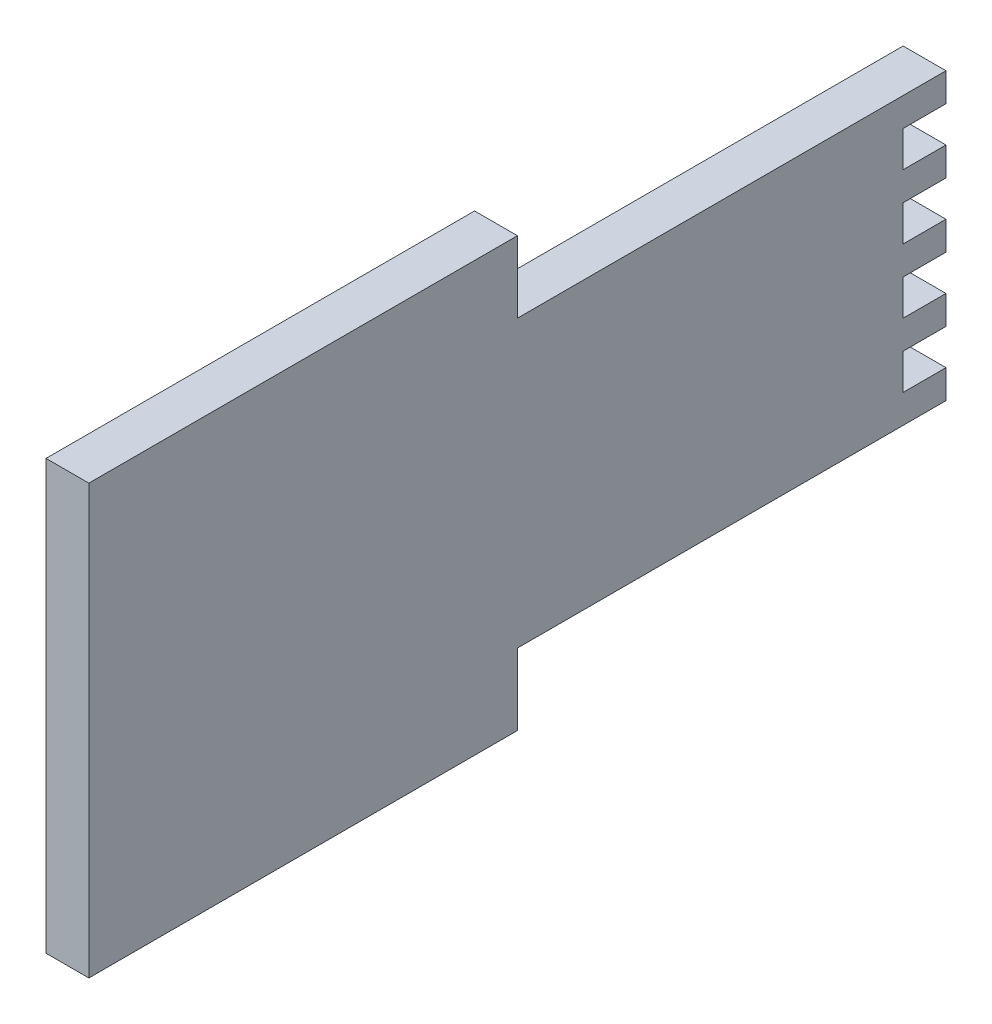
ISO-10303-21;
HEADER;
FILE_DESCRIPTION(('STEP AP214'),'2;1');
FILE_NAME('part.step','',(''),(''),'','','');
FILE_SCHEMA(('AUTOMOTIVE_DESIGN { 1 0 10303 214 1 1 1 1 }'));
ENDSEC;
DATA;
#1=APPLICATION_CONTEXT('core data for automotive mechanical design processes');
#2=APPLICATION_PROTOCOL_DEFINITION('international standard','automotive_design',2000,#1);
#3=PRODUCT_CONTEXT('',#1,'mechanical');
#4=PRODUCT('Part','Part','',(#3));
#5=PRODUCT_RELATED_PRODUCT_CATEGORY('part','',(#4));
#6=PRODUCT_DEFINITION_FORMATION('','',#4);
#7=PRODUCT_DEFINITION_CONTEXT('part definition',#1,'design');
#8=PRODUCT_DEFINITION('design','',#6,#7);
#9=PRODUCT_DEFINITION_SHAPE('','',#8);
#10=(LENGTH_UNIT() NAMED_UNIT(*) SI_UNIT(.MILLI.,.METRE.));
#11=(NAMED_UNIT(*) PLANE_ANGLE_UNIT() SI_UNIT($,.RADIAN.));
#12=(NAMED_UNIT(*) SI_UNIT($,.STERADIAN.) SOLID_ANGLE_UNIT());
#13=UNCERTAINTY_MEASURE_WITH_UNIT(LENGTH_MEASURE(1.E-05),#10,'distance_accuracy_value','');
#14=(GEOMETRIC_REPRESENTATION_CONTEXT(3) GLOBAL_UNCERTAINTY_ASSIGNED_CONTEXT((#13)) GLOBAL_UNIT_ASSIGNED_CONTEXT((#10,
#11,#12)) REPRESENTATION_CONTEXT('',''));
#15=CARTESIAN_POINT('',(0.,0.,0.));
#16=DIRECTION('',(0.,0.,1.));
#17=DIRECTION('',(1.,0.,0.));
#18=AXIS2_PLACEMENT_3D('',#15,#16,#17);
#19=CARTESIAN_POINT('',(3.,8.,-30.));
#20=DIRECTION('',(0.,0.,1.));
#21=DIRECTION('',(1.,0.,0.));
#22=AXIS2_PLACEMENT_3D('',#19,#20,#21);
#23=PLANE('',#22);
#24=DIRECTION('',(0.,1.,0.));
#25=VECTOR('',#24,1.);
#26=CARTESIAN_POINT('',(0.,8.,-30.));
#27=LINE('',#26,#25);
#28=CARTESIAN_POINT('',(0.,8.,-30.));
#29=VERTEX_POINT('',#28);
#30=CARTESIAN_POINT('',(0.,10.,-30.));
#31=VERTEX_POINT('',#30);
#32=EDGE_CURVE('E225',#29,#31,#27,.T.);
#33=ORIENTED_EDGE('',*,*,#32,.T.);
#34=DIRECTION('',(-1.,0.,0.));
#35=VECTOR('',#34,1.);
#36=CARTESIAN_POINT('',(3.,10.,-30.));
#37=LINE('',#36,#35);
#38=CARTESIAN_POINT('',(3.,10.,-30.));
#39=VERTEX_POINT('',#38);
#40=EDGE_CURVE('E11',#39,#31,#37,.T.);
#41=ORIENTED_EDGE('',*,*,#40,.F.);
#42=DIRECTION('',(0.,1.,0.));
#43=VECTOR('',#42,1.);
#44=CARTESIAN_POINT('',(3.,8.,-30.));
#45=LINE('',#44,#43);
#46=CARTESIAN_POINT('',(3.,8.,-30.));
#47=VERTEX_POINT('',#46);
#48=EDGE_CURVE('E271',#47,#39,#45,.T.);
#49=ORIENTED_EDGE('',*,*,#48,.F.);
#50=DIRECTION('',(-1.,0.,0.));
#51=VECTOR('',#50,1.);
#52=CARTESIAN_POINT('',(3.,8.,-30.));
#53=LINE('',#52,#51);
#54=EDGE_CURVE('E221',#47,#29,#53,.T.);
#55=ORIENTED_EDGE('',*,*,#54,.T.);
#56=EDGE_LOOP('',(#33,#41,#49,#55));
#57=FACE_BOUND('',#56,.T.);
#58=ADVANCED_FACE('F33',(#57),#23,.F.);
#59=CARTESIAN_POINT('',(3.,10.,-30.));
#60=DIRECTION('',(0.,-1.,0.));
#61=DIRECTION('',(0.,0.,-1.));
#62=AXIS2_PLACEMENT_3D('',#59,#60,#61);
#63=PLANE('',#62);
#64=DIRECTION('',(0.,0.,1.));
#65=VECTOR('',#64,1.);
#66=CARTESIAN_POINT('',(0.,10.,-30.));
#67=LINE('',#66,#65);
#68=CARTESIAN_POINT('',(0.,10.,0.));
#69=VERTEX_POINT('',#68);
#70=EDGE_CURVE('E228',#31,#69,#67,.T.);
#71=ORIENTED_EDGE('',*,*,#70,.T.);
#72=DIRECTION('',(-1.,0.,0.));
#73=VECTOR('',#72,1.);
#74=CARTESIAN_POINT('',(3.,10.,0.));
#75=LINE('',#74,#73);
#76=CARTESIAN_POINT('',(3.,10.,0.));
#77=VERTEX_POINT('',#76);
#78=EDGE_CURVE('E41',#77,#69,#75,.T.);
#79=ORIENTED_EDGE('',*,*,#78,.F.);
#80=DIRECTION('',(0.,0.,1.));
#81=VECTOR('',#80,1.);
#82=CARTESIAN_POINT('',(3.,10.,-30.));
#83=LINE('',#82,#81);
#84=EDGE_CURVE('E140',#39,#77,#83,.T.);
#85=ORIENTED_EDGE('',*,*,#84,.F.);
#86=ORIENTED_EDGE('',*,*,#40,.T.);
#87=EDGE_LOOP('',(#71,#79,#85,#86));
#88=FACE_BOUND('',#87,.T.);
#89=ADVANCED_FACE('F409',(#88),#63,.F.);
#90=CARTESIAN_POINT('',(3.,10.,0.));
#91=DIRECTION('',(0.,0.,1.));
#92=DIRECTION('',(1.,0.,0.));
#93=AXIS2_PLACEMENT_3D('',#90,#91,#92);
#94=PLANE('',#93);
#95=DIRECTION('',(0.,1.,0.));
#96=VECTOR('',#95,1.);
#97=CARTESIAN_POINT('',(0.,10.,0.));
#98=LINE('',#97,#96);
#99=CARTESIAN_POINT('',(0.,15.,0.));
#100=VERTEX_POINT('',#99);
#101=EDGE_CURVE('E230',#69,#100,#98,.T.);
#102=ORIENTED_EDGE('',*,*,#101,.T.);
#103=DIRECTION('',(-1.,0.,0.));
#104=VECTOR('',#103,1.);
#105=CARTESIAN_POINT('',(3.,15.,0.));
#106=LINE('',#105,#104);
#107=CARTESIAN_POINT('',(3.,15.,0.));
#108=VERTEX_POINT('',#107);
#109=EDGE_CURVE('E326',#108,#100,#106,.T.);
#110=ORIENTED_EDGE('',*,*,#109,.F.);
#111=DIRECTION('',(0.,1.,0.));
#112=VECTOR('',#111,1.);
#113=CARTESIAN_POINT('',(3.,10.,0.));
#114=LINE('',#113,#112);
#115=EDGE_CURVE('E334',#77,#108,#114,.T.);
#116=ORIENTED_EDGE('',*,*,#115,.F.);
#117=ORIENTED_EDGE('',*,*,#78,.T.);
#118=EDGE_LOOP('',(#102,#110,#116,#117));
#119=FACE_BOUND('',#118,.T.);
#120=ADVANCED_FACE('F332',(#119),#94,.F.);
#121=CARTESIAN_POINT('',(3.,15.,0.));
#122=DIRECTION('',(0.,-1.,0.));
#123=DIRECTION('',(0.,0.,-1.));
#124=AXIS2_PLACEMENT_3D('',#121,#122,#123);
#125=PLANE('',#124);
#126=DIRECTION('',(0.,0.,1.));
#127=VECTOR('',#126,1.);
#128=CARTESIAN_POINT('',(0.,15.,0.));
#129=LINE('',#128,#127);
#130=CARTESIAN_POINT('',(0.,15.,30.));
#131=VERTEX_POINT('',#130);
#132=EDGE_CURVE('E232',#100,#131,#129,.T.);
#133=ORIENTED_EDGE('',*,*,#132,.T.);
#134=DIRECTION('',(-1.,0.,0.));
#135=VECTOR('',#134,1.);
#136=CARTESIAN_POINT('',(3.,15.,30.));
#137=LINE('',#136,#135);
#138=CARTESIAN_POINT('',(3.,15.,30.));
#139=VERTEX_POINT('',#138);
#140=EDGE_CURVE('E323',#139,#131,#137,.T.);
#141=ORIENTED_EDGE('',*,*,#140,.F.);
#142=DIRECTION('',(0.,0.,1.));
#143=VECTOR('',#142,1.);
#144=CARTESIAN_POINT('',(3.,15.,0.));
#145=LINE('',#144,#143);
#146=EDGE_CURVE('E352',#108,#139,#145,.T.);
#147=ORIENTED_EDGE('',*,*,#146,.F.);
#148=ORIENTED_EDGE('',*,*,#109,.T.);
#149=EDGE_LOOP('',(#133,#141,#147,#148));
#150=FACE_BOUND('',#149,.T.);
#151=ADVANCED_FACE('F343',(#150),#125,.F.);
#152=CARTESIAN_POINT('',(3.,15.,30.));
#153=DIRECTION('',(0.,0.,-1.));
#154=DIRECTION('',(-1.,0.,0.));
#155=AXIS2_PLACEMENT_3D('',#152,#153,#154);
#156=PLANE('',#155);
#157=DIRECTION('',(0.,-1.,0.));
#158=VECTOR('',#157,1.);
#159=CARTESIAN_POINT('',(0.,15.,30.));
#160=LINE('',#159,#158);
#161=CARTESIAN_POINT('',(0.,-15.,30.));
#162=VERTEX_POINT('',#161);
#163=EDGE_CURVE('E234',#131,#162,#160,.T.);
#164=ORIENTED_EDGE('',*,*,#163,.T.);
#165=DIRECTION('',(-1.,0.,0.));
#166=VECTOR('',#165,1.);
#167=CARTESIAN_POINT('',(3.,-15.,30.));
#168=LINE('',#167,#166);
#169=CARTESIAN_POINT('',(3.,-15.,30.));
#170=VERTEX_POINT('',#169);
#171=EDGE_CURVE('E320',#170,#162,#168,.T.);
#172=ORIENTED_EDGE('',*,*,#171,.F.);
#173=DIRECTION('',(0.,-1.,0.));
#174=VECTOR('',#173,1.);
#175=CARTESIAN_POINT('',(3.,15.,30.));
#176=LINE('',#175,#174);
#177=EDGE_CURVE('E349',#139,#170,#176,.T.);
#178=ORIENTED_EDGE('',*,*,#177,.F.);
#179=ORIENTED_EDGE('',*,*,#140,.T.);
#180=EDGE_LOOP('',(#164,#172,#178,#179));
#181=FACE_BOUND('',#180,.T.);
#182=ADVANCED_FACE('F347',(#181),#156,.F.);
#183=CARTESIAN_POINT('',(3.,-15.,30.));
#184=DIRECTION('',(0.,1.,0.));
#185=DIRECTION('',(0.,0.,1.));
#186=AXIS2_PLACEMENT_3D('',#183,#184,#185);
#187=PLANE('',#186);
#188=DIRECTION('',(0.,0.,-1.));
#189=VECTOR('',#188,1.);
#190=CARTESIAN_POINT('',(0.,-15.,30.));
#191=LINE('',#190,#189);
#192=CARTESIAN_POINT('',(0.,-15.,0.));
#193=VERTEX_POINT('',#192);
#194=EDGE_CURVE('E236',#162,#193,#191,.T.);
#195=ORIENTED_EDGE('',*,*,#194,.T.);
#196=DIRECTION('',(-1.,0.,0.));
#197=VECTOR('',#196,1.);
#198=CARTESIAN_POINT('',(3.,-15.,0.));
#199=LINE('',#198,#197);
#200=CARTESIAN_POINT('',(3.,-15.,0.));
#201=VERTEX_POINT('',#200);
#202=EDGE_CURVE('E317',#201,#193,#199,.T.);
#203=ORIENTED_EDGE('',*,*,#202,.F.);
#204=DIRECTION('',(0.,0.,-1.));
#205=VECTOR('',#204,1.);
#206=CARTESIAN_POINT('',(3.,-15.,30.));
#207=LINE('',#206,#205);
#208=EDGE_CURVE('E351',#170,#201,#207,.T.);
#209=ORIENTED_EDGE('',*,*,#208,.F.);
#210=ORIENTED_EDGE('',*,*,#171,.T.);
#211=EDGE_LOOP('',(#195,#203,#209,#210));
#212=FACE_BOUND('',#211,.T.);
#213=ADVANCED_FACE('F422',(#212),#187,.F.);
#214=CARTESIAN_POINT('',(3.,-15.,0.));
#215=DIRECTION('',(0.,0.,1.));
#216=DIRECTION('',(1.,0.,0.));
#217=AXIS2_PLACEMENT_3D('',#214,#215,#216);
#218=PLANE('',#217);
#219=DIRECTION('',(0.,1.,0.));
#220=VECTOR('',#219,1.);
#221=CARTESIAN_POINT('',(0.,-15.,0.));
#222=LINE('',#221,#220);
#223=CARTESIAN_POINT('',(0.,-10.,0.));
#224=VERTEX_POINT('',#223);
#225=EDGE_CURVE('E238',#193,#224,#222,.T.);
#226=ORIENTED_EDGE('',*,*,#225,.T.);
#227=DIRECTION('',(-1.,0.,0.));
#228=VECTOR('',#227,1.);
#229=CARTESIAN_POINT('',(3.,-10.,0.));
#230=LINE('',#229,#228);
#231=CARTESIAN_POINT('',(3.,-10.,0.));
#232=VERTEX_POINT('',#231);
#233=EDGE_CURVE('E314',#232,#224,#230,.T.);
#234=ORIENTED_EDGE('',*,*,#233,.F.);
#235=DIRECTION('',(0.,1.,0.));
#236=VECTOR('',#235,1.);
#237=CARTESIAN_POINT('',(3.,-15.,0.));
#238=LINE('',#237,#236);
#239=EDGE_CURVE('E354',#201,#232,#238,.T.);
#240=ORIENTED_EDGE('',*,*,#239,.F.);
#241=ORIENTED_EDGE('',*,*,#202,.T.);
#242=EDGE_LOOP('',(#226,#234,#240,#241));
#243=FACE_BOUND('',#242,.T.);
#244=ADVANCED_FACE('F425',(#243),#218,.F.);
#245=CARTESIAN_POINT('',(3.,-10.,0.));
#246=DIRECTION('',(0.,1.,0.));
#247=DIRECTION('',(0.,0.,1.));
#248=AXIS2_PLACEMENT_3D('',#245,#246,#247);
#249=PLANE('',#248);
#250=DIRECTION('',(0.,0.,-1.));
#251=VECTOR('',#250,1.);
#252=CARTESIAN_POINT('',(0.,-10.,0.));
#253=LINE('',#252,#251);
#254=CARTESIAN_POINT('',(0.,-10.,-30.));
#255=VERTEX_POINT('',#254);
#256=EDGE_CURVE('E240',#224,#255,#253,.T.);
#257=ORIENTED_EDGE('',*,*,#256,.T.);
#258=DIRECTION('',(-1.,0.,0.));
#259=VECTOR('',#258,1.);
#260=CARTESIAN_POINT('',(3.,-10.,-30.));
#261=LINE('',#260,#259);
#262=CARTESIAN_POINT('',(3.,-10.,-30.));
#263=VERTEX_POINT('',#262);
#264=EDGE_CURVE('E311',#263,#255,#261,.T.);
#265=ORIENTED_EDGE('',*,*,#264,.F.);
#266=DIRECTION('',(0.,0.,-1.));
#267=VECTOR('',#266,1.);
#268=CARTESIAN_POINT('',(3.,-10.,0.));
#269=LINE('',#268,#267);
#270=EDGE_CURVE('E360',#232,#263,#269,.T.);
#271=ORIENTED_EDGE('',*,*,#270,.F.);
#272=ORIENTED_EDGE('',*,*,#233,.T.);
#273=EDGE_LOOP('',(#257,#265,#271,#272));
#274=FACE_BOUND('',#273,.T.);
#275=ADVANCED_FACE('F429',(#274),#249,.F.);
#276=CARTESIAN_POINT('',(3.,-10.,-30.));
#277=DIRECTION('',(0.,0.,1.));
#278=DIRECTION('',(0.,-1.,0.));
#279=AXIS2_PLACEMENT_3D('',#276,#277,#278);
#280=PLANE('',#279);
#281=DIRECTION('',(0.,1.,0.));
#282=VECTOR('',#281,1.);
#283=CARTESIAN_POINT('',(0.,-10.,-30.));
#284=LINE('',#283,#282);
#285=CARTESIAN_POINT('',(0.,-8.,-30.));
#286=VERTEX_POINT('',#285);
#287=EDGE_CURVE('E242',#255,#286,#284,.T.);
#288=ORIENTED_EDGE('',*,*,#287,.T.);
#289=DIRECTION('',(-1.,0.,0.));
#290=VECTOR('',#289,1.);
#291=CARTESIAN_POINT('',(3.,-8.,-30.));
#292=LINE('',#291,#290);
#293=CARTESIAN_POINT('',(3.,-8.,-30.));
#294=VERTEX_POINT('',#293);
#295=EDGE_CURVE('E308',#294,#286,#292,.T.);
#296=ORIENTED_EDGE('',*,*,#295,.F.);
#297=DIRECTION('',(0.,1.,0.));
#298=VECTOR('',#297,1.);
#299=CARTESIAN_POINT('',(3.,-10.,-30.));
#300=LINE('',#299,#298);
#301=EDGE_CURVE('E362',#263,#294,#300,.T.);
#302=ORIENTED_EDGE('',*,*,#301,.F.);
#303=ORIENTED_EDGE('',*,*,#264,.T.);
#304=EDGE_LOOP('',(#288,#296,#302,#303));
#305=FACE_BOUND('',#304,.T.);
#306=ADVANCED_FACE('F433',(#305),#280,.F.);
#307=CARTESIAN_POINT('',(3.,-8.,-30.));
#308=DIRECTION('',(0.,-1.,0.));
#309=DIRECTION('',(0.,0.,-1.));
#310=AXIS2_PLACEMENT_3D('',#307,#308,#309);
#311=PLANE('',#310);
#312=DIRECTION('',(0.,0.,1.));
#313=VECTOR('',#312,1.);
#314=CARTESIAN_POINT('',(0.,-8.,-30.));
#315=LINE('',#314,#313);
#316=CARTESIAN_POINT('',(0.,-8.,-27.));
#317=VERTEX_POINT('',#316);
#318=EDGE_CURVE('E244',#286,#317,#315,.T.);
#319=ORIENTED_EDGE('',*,*,#318,.T.);
#320=DIRECTION('',(-1.,0.,0.));
#321=VECTOR('',#320,1.);
#322=CARTESIAN_POINT('',(3.,-8.,-27.));
#323=LINE('',#322,#321);
#324=CARTESIAN_POINT('',(3.,-8.,-27.));
#325=VERTEX_POINT('',#324);
#326=EDGE_CURVE('E305',#325,#317,#323,.T.);
#327=ORIENTED_EDGE('',*,*,#326,.F.);
#328=DIRECTION('',(0.,0.,1.));
#329=VECTOR('',#328,1.);
#330=CARTESIAN_POINT('',(3.,-8.,-30.));
#331=LINE('',#330,#329);
#332=EDGE_CURVE('E364',#294,#325,#331,.T.);
#333=ORIENTED_EDGE('',*,*,#332,.F.);
#334=ORIENTED_EDGE('',*,*,#295,.T.);
#335=EDGE_LOOP('',(#319,#327,#333,#334));
#336=FACE_BOUND('',#335,.T.);
#337=ADVANCED_FACE('F437',(#336),#311,.F.);
#338=CARTESIAN_POINT('',(3.,-8.,-27.));
#339=DIRECTION('',(0.,0.,1.));
#340=DIRECTION('',(1.,0.,0.));
#341=AXIS2_PLACEMENT_3D('',#338,#339,#340);
#342=PLANE('',#341);
#343=DIRECTION('',(0.,1.,0.));
#344=VECTOR('',#343,1.);
#345=CARTESIAN_POINT('',(0.,-8.,-27.));
#346=LINE('',#345,#344);
#347=CARTESIAN_POINT('',(0.,-5.5,-27.));
#348=VERTEX_POINT('',#347);
#349=EDGE_CURVE('E246',#317,#348,#346,.T.);
#350=ORIENTED_EDGE('',*,*,#349,.T.);
#351=DIRECTION('',(-1.,0.,0.));
#352=VECTOR('',#351,1.);
#353=CARTESIAN_POINT('',(3.,-5.5,-27.));
#354=LINE('',#353,#352);
#355=CARTESIAN_POINT('',(3.,-5.5,-27.));
#356=VERTEX_POINT('',#355);
#357=EDGE_CURVE('E302',#356,#348,#354,.T.);
#358=ORIENTED_EDGE('',*,*,#357,.F.);
#359=DIRECTION('',(0.,1.,0.));
#360=VECTOR('',#359,1.);
#361=CARTESIAN_POINT('',(3.,-8.,-27.));
#362=LINE('',#361,#360);
#363=EDGE_CURVE('E366',#325,#356,#362,.T.);
#364=ORIENTED_EDGE('',*,*,#363,.F.);
#365=ORIENTED_EDGE('',*,*,#326,.T.);
#366=EDGE_LOOP('',(#350,#358,#364,#365));
#367=FACE_BOUND('',#366,.T.);
#368=ADVANCED_FACE('F441',(#367),#342,.F.);
#369=CARTESIAN_POINT('',(3.,-5.5,-27.));
#370=DIRECTION('',(0.,1.,0.));
#371=DIRECTION('',(0.,0.,1.));
#372=AXIS2_PLACEMENT_3D('',#369,#370,#371);
#373=PLANE('',#372);
#374=DIRECTION('',(0.,0.,-1.));
#375=VECTOR('',#374,1.);
#376=CARTESIAN_POINT('',(0.,-5.5,-27.));
#377=LINE('',#376,#375);
#378=CARTESIAN_POINT('',(0.,-5.5,-30.));
#379=VERTEX_POINT('',#378);
#380=EDGE_CURVE('E248',#348,#379,#377,.T.);
#381=ORIENTED_EDGE('',*,*,#380,.T.);
#382=DIRECTION('',(-1.,0.,0.));
#383=VECTOR('',#382,1.);
#384=CARTESIAN_POINT('',(3.,-5.5,-30.));
#385=LINE('',#384,#383);
#386=CARTESIAN_POINT('',(3.,-5.5,-30.));
#387=VERTEX_POINT('',#386);
#388=EDGE_CURVE('E299',#387,#379,#385,.T.);
#389=ORIENTED_EDGE('',*,*,#388,.F.);
#390=DIRECTION('',(0.,0.,-1.));
#391=VECTOR('',#390,1.);
#392=CARTESIAN_POINT('',(3.,-5.5,-27.));
#393=LINE('',#392,#391);
#394=EDGE_CURVE('E368',#356,#387,#393,.T.);
#395=ORIENTED_EDGE('',*,*,#394,.F.);
#396=ORIENTED_EDGE('',*,*,#357,.T.);
#397=EDGE_LOOP('',(#381,#389,#395,#396));
#398=FACE_BOUND('',#397,.T.);
#399=ADVANCED_FACE('F445',(#398),#373,.F.);
#400=CARTESIAN_POINT('',(3.,-5.5,-30.));
#401=DIRECTION('',(0.,0.,1.));
#402=DIRECTION('',(1.,0.,0.));
#403=AXIS2_PLACEMENT_3D('',#400,#401,#402);
#404=PLANE('',#403);
#405=DIRECTION('',(0.,1.,0.));
#406=VECTOR('',#405,1.);
#407=CARTESIAN_POINT('',(0.,-5.5,-30.));
#408=LINE('',#407,#406);
#409=CARTESIAN_POINT('',(0.,-3.5,-30.));
#410=VERTEX_POINT('',#409);
#411=EDGE_CURVE('E250',#379,#410,#408,.T.);
#412=ORIENTED_EDGE('',*,*,#411,.T.);
#413=DIRECTION('',(-1.,0.,0.));
#414=VECTOR('',#413,1.);
#415=CARTESIAN_POINT('',(3.,-3.5,-30.));
#416=LINE('',#415,#414);
#417=CARTESIAN_POINT('',(3.,-3.5,-30.));
#418=VERTEX_POINT('',#417);
#419=EDGE_CURVE('E296',#418,#410,#416,.T.);
#420=ORIENTED_EDGE('',*,*,#419,.F.);
#421=DIRECTION('',(0.,1.,0.));
#422=VECTOR('',#421,1.);
#423=CARTESIAN_POINT('',(3.,-5.5,-30.));
#424=LINE('',#423,#422);
#425=EDGE_CURVE('E370',#387,#418,#424,.T.);
#426=ORIENTED_EDGE('',*,*,#425,.F.);
#427=ORIENTED_EDGE('',*,*,#388,.T.);
#428=EDGE_LOOP('',(#412,#420,#426,#427));
#429=FACE_BOUND('',#428,.T.);
#430=ADVANCED_FACE('F449',(#429),#404,.F.);
#431=CARTESIAN_POINT('',(3.,-3.5,-30.));
#432=DIRECTION('',(0.,-1.,0.));
#433=DIRECTION('',(0.,0.,-1.));
#434=AXIS2_PLACEMENT_3D('',#431,#432,#433);
#435=PLANE('',#434);
#436=DIRECTION('',(0.,0.,1.));
#437=VECTOR('',#436,1.);
#438=CARTESIAN_POINT('',(0.,-3.5,-30.));
#439=LINE('',#438,#437);
#440=CARTESIAN_POINT('',(0.,-3.5,-27.));
#441=VERTEX_POINT('',#440);
#442=EDGE_CURVE('E252',#410,#441,#439,.T.);
#443=ORIENTED_EDGE('',*,*,#442,.T.);
#444=DIRECTION('',(-1.,0.,0.));
#445=VECTOR('',#444,1.);
#446=CARTESIAN_POINT('',(3.,-3.5,-27.));
#447=LINE('',#446,#445);
#448=CARTESIAN_POINT('',(3.,-3.5,-27.));
#449=VERTEX_POINT('',#448);
#450=EDGE_CURVE('E293',#449,#441,#447,.T.);
#451=ORIENTED_EDGE('',*,*,#450,.F.);
#452=DIRECTION('',(0.,0.,1.));
#453=VECTOR('',#452,1.);
#454=CARTESIAN_POINT('',(3.,-3.5,-30.));
#455=LINE('',#454,#453);
#456=EDGE_CURVE('E372',#418,#449,#455,.T.);
#457=ORIENTED_EDGE('',*,*,#456,.F.);
#458=ORIENTED_EDGE('',*,*,#419,.T.);
#459=EDGE_LOOP('',(#443,#451,#457,#458));
#460=FACE_BOUND('',#459,.T.);
#461=ADVANCED_FACE('F453',(#460),#435,.F.);
#462=CARTESIAN_POINT('',(3.,-3.5,-27.));
#463=DIRECTION('',(0.,0.,1.));
#464=DIRECTION('',(1.,0.,0.));
#465=AXIS2_PLACEMENT_3D('',#462,#463,#464);
#466=PLANE('',#465);
#467=DIRECTION('',(0.,1.,0.));
#468=VECTOR('',#467,1.);
#469=CARTESIAN_POINT('',(0.,-3.5,-27.));
#470=LINE('',#469,#468);
#471=CARTESIAN_POINT('',(0.,-1.,-27.));
#472=VERTEX_POINT('',#471);
#473=EDGE_CURVE('E254',#441,#472,#470,.T.);
#474=ORIENTED_EDGE('',*,*,#473,.T.);
#475=DIRECTION('',(-1.,0.,0.));
#476=VECTOR('',#475,1.);
#477=CARTESIAN_POINT('',(3.,-1.,-27.));
#478=LINE('',#477,#476);
#479=CARTESIAN_POINT('',(3.,-1.,-27.));
#480=VERTEX_POINT('',#479);
#481=EDGE_CURVE('E290',#480,#472,#478,.T.);
#482=ORIENTED_EDGE('',*,*,#481,.F.);
#483=DIRECTION('',(0.,1.,0.));
#484=VECTOR('',#483,1.);
#485=CARTESIAN_POINT('',(3.,-3.5,-27.));
#486=LINE('',#485,#484);
#487=EDGE_CURVE('E374',#449,#480,#486,.T.);
#488=ORIENTED_EDGE('',*,*,#487,.F.);
#489=ORIENTED_EDGE('',*,*,#450,.T.);
#490=EDGE_LOOP('',(#474,#482,#488,#489));
#491=FACE_BOUND('',#490,.T.);
#492=ADVANCED_FACE('F457',(#491),#466,.F.);
#493=CARTESIAN_POINT('',(3.,-1.,-27.));
#494=DIRECTION('',(0.,1.,0.));
#495=DIRECTION('',(0.,0.,1.));
#496=AXIS2_PLACEMENT_3D('',#493,#494,#495);
#497=PLANE('',#496);
#498=DIRECTION('',(0.,0.,-1.));
#499=VECTOR('',#498,1.);
#500=CARTESIAN_POINT('',(0.,-1.,-27.));
#501=LINE('',#500,#499);
#502=CARTESIAN_POINT('',(0.,-1.,-30.));
#503=VERTEX_POINT('',#502);
#504=EDGE_CURVE('E256',#472,#503,#501,.T.);
#505=ORIENTED_EDGE('',*,*,#504,.T.);
#506=DIRECTION('',(-1.,0.,0.));
#507=VECTOR('',#506,1.);
#508=CARTESIAN_POINT('',(3.,-1.,-30.));
#509=LINE('',#508,#507);
#510=CARTESIAN_POINT('',(3.,-1.,-30.));
#511=VERTEX_POINT('',#510);
#512=EDGE_CURVE('E287',#511,#503,#509,.T.);
#513=ORIENTED_EDGE('',*,*,#512,.F.);
#514=DIRECTION('',(0.,0.,-1.));
#515=VECTOR('',#514,1.);
#516=CARTESIAN_POINT('',(3.,-1.,-27.));
#517=LINE('',#516,#515);
#518=EDGE_CURVE('E376',#480,#511,#517,.T.);
#519=ORIENTED_EDGE('',*,*,#518,.F.);
#520=ORIENTED_EDGE('',*,*,#481,.T.);
#521=EDGE_LOOP('',(#505,#513,#519,#520));
#522=FACE_BOUND('',#521,.T.);
#523=ADVANCED_FACE('F461',(#522),#497,.F.);
#524=CARTESIAN_POINT('',(3.,-1.,-30.));
#525=DIRECTION('',(0.,0.,1.));
#526=DIRECTION('',(1.,0.,0.));
#527=AXIS2_PLACEMENT_3D('',#524,#525,#526);
#528=PLANE('',#527);
#529=DIRECTION('',(0.,1.,0.));
#530=VECTOR('',#529,1.);
#531=CARTESIAN_POINT('',(0.,-1.,-30.));
#532=LINE('',#531,#530);
#533=CARTESIAN_POINT('',(0.,1.,-30.));
#534=VERTEX_POINT('',#533);
#535=EDGE_CURVE('E258',#503,#534,#532,.T.);
#536=ORIENTED_EDGE('',*,*,#535,.T.);
#537=DIRECTION('',(-1.,0.,0.));
#538=VECTOR('',#537,1.);
#539=CARTESIAN_POINT('',(3.,1.,-30.));
#540=LINE('',#539,#538);
#541=CARTESIAN_POINT('',(3.,1.,-30.));
#542=VERTEX_POINT('',#541);
#543=EDGE_CURVE('E284',#542,#534,#540,.T.);
#544=ORIENTED_EDGE('',*,*,#543,.F.);
#545=DIRECTION('',(0.,1.,0.));
#546=VECTOR('',#545,1.);
#547=CARTESIAN_POINT('',(3.,-1.,-30.));
#548=LINE('',#547,#546);
#549=EDGE_CURVE('E378',#511,#542,#548,.T.);
#550=ORIENTED_EDGE('',*,*,#549,.F.);
#551=ORIENTED_EDGE('',*,*,#512,.T.);
#552=EDGE_LOOP('',(#536,#544,#550,#551));
#553=FACE_BOUND('',#552,.T.);
#554=ADVANCED_FACE('F465',(#553),#528,.F.);
#555=CARTESIAN_POINT('',(3.,1.,-30.));
#556=DIRECTION('',(0.,-1.,0.));
#557=DIRECTION('',(0.,0.,-1.));
#558=AXIS2_PLACEMENT_3D('',#555,#556,#557);
#559=PLANE('',#558);
#560=DIRECTION('',(0.,0.,1.));
#561=VECTOR('',#560,1.);
#562=CARTESIAN_POINT('',(0.,1.,-30.));
#563=LINE('',#562,#561);
#564=CARTESIAN_POINT('',(0.,1.,-27.));
#565=VERTEX_POINT('',#564);
#566=EDGE_CURVE('E260',#534,#565,#563,.T.);
#567=ORIENTED_EDGE('',*,*,#566,.T.);
#568=DIRECTION('',(-1.,0.,0.));
#569=VECTOR('',#568,1.);
#570=CARTESIAN_POINT('',(3.,1.,-27.));
#571=LINE('',#570,#569);
#572=CARTESIAN_POINT('',(3.,1.,-27.));
#573=VERTEX_POINT('',#572);
#574=EDGE_CURVE('E281',#573,#565,#571,.T.);
#575=ORIENTED_EDGE('',*,*,#574,.F.);
#576=DIRECTION('',(0.,0.,1.));
#577=VECTOR('',#576,1.);
#578=CARTESIAN_POINT('',(3.,1.,-30.));
#579=LINE('',#578,#577);
#580=EDGE_CURVE('E380',#542,#573,#579,.T.);
#581=ORIENTED_EDGE('',*,*,#580,.F.);
#582=ORIENTED_EDGE('',*,*,#543,.T.);
#583=EDGE_LOOP('',(#567,#575,#581,#582));
#584=FACE_BOUND('',#583,.T.);
#585=ADVANCED_FACE('F469',(#584),#559,.F.);
#586=CARTESIAN_POINT('',(3.,1.,-27.));
#587=DIRECTION('',(0.,0.,1.));
#588=DIRECTION('',(1.,0.,0.));
#589=AXIS2_PLACEMENT_3D('',#586,#587,#588);
#590=PLANE('',#589);
#591=DIRECTION('',(0.,1.,0.));
#592=VECTOR('',#591,1.);
#593=CARTESIAN_POINT('',(0.,1.,-27.));
#594=LINE('',#593,#592);
#595=CARTESIAN_POINT('',(0.,3.5,-27.));
#596=VERTEX_POINT('',#595);
#597=EDGE_CURVE('E262',#565,#596,#594,.T.);
#598=ORIENTED_EDGE('',*,*,#597,.T.);
#599=DIRECTION('',(-1.,0.,0.));
#600=VECTOR('',#599,1.);
#601=CARTESIAN_POINT('',(3.,3.5,-27.));
#602=LINE('',#601,#600);
#603=CARTESIAN_POINT('',(3.,3.5,-27.));
#604=VERTEX_POINT('',#603);
#605=EDGE_CURVE('E278',#604,#596,#602,.T.);
#606=ORIENTED_EDGE('',*,*,#605,.F.);
#607=DIRECTION('',(0.,1.,0.));
#608=VECTOR('',#607,1.);
#609=CARTESIAN_POINT('',(3.,1.,-27.));
#610=LINE('',#609,#608);
#611=EDGE_CURVE('E382',#573,#604,#610,.T.);
#612=ORIENTED_EDGE('',*,*,#611,.F.);
#613=ORIENTED_EDGE('',*,*,#574,.T.);
#614=EDGE_LOOP('',(#598,#606,#612,#613));
#615=FACE_BOUND('',#614,.T.);
#616=ADVANCED_FACE('F473',(#615),#590,.F.);
#617=CARTESIAN_POINT('',(3.,3.5,-27.));
#618=DIRECTION('',(0.,1.,0.));
#619=DIRECTION('',(0.,0.,1.));
#620=AXIS2_PLACEMENT_3D('',#617,#618,#619);
#621=PLANE('',#620);
#622=DIRECTION('',(0.,0.,-1.));
#623=VECTOR('',#622,1.);
#624=CARTESIAN_POINT('',(0.,3.5,-27.));
#625=LINE('',#624,#623);
#626=CARTESIAN_POINT('',(0.,3.5,-30.));
#627=VERTEX_POINT('',#626);
#628=EDGE_CURVE('E264',#596,#627,#625,.T.);
#629=ORIENTED_EDGE('',*,*,#628,.T.);
#630=DIRECTION('',(-1.,0.,0.));
#631=VECTOR('',#630,1.);
#632=CARTESIAN_POINT('',(3.,3.5,-30.));
#633=LINE('',#632,#631);
#634=CARTESIAN_POINT('',(3.,3.5,-30.));
#635=VERTEX_POINT('',#634);
#636=EDGE_CURVE('E275',#635,#627,#633,.T.);
#637=ORIENTED_EDGE('',*,*,#636,.F.);
#638=DIRECTION('',(0.,0.,-1.));
#639=VECTOR('',#638,1.);
#640=CARTESIAN_POINT('',(3.,3.5,-27.));
#641=LINE('',#640,#639);
#642=EDGE_CURVE('E384',#604,#635,#641,.T.);
#643=ORIENTED_EDGE('',*,*,#642,.F.);
#644=ORIENTED_EDGE('',*,*,#605,.T.);
#645=EDGE_LOOP('',(#629,#637,#643,#644));
#646=FACE_BOUND('',#645,.T.);
#647=ADVANCED_FACE('F390',(#646),#621,.F.);
#648=CARTESIAN_POINT('',(3.,3.5,-30.));
#649=DIRECTION('',(0.,0.,1.));
#650=DIRECTION('',(1.,0.,0.));
#651=AXIS2_PLACEMENT_3D('',#648,#649,#650);
#652=PLANE('',#651);
#653=DIRECTION('',(0.,1.,0.));
#654=VECTOR('',#653,1.);
#655=CARTESIAN_POINT('',(0.,3.5,-30.));
#656=LINE('',#655,#654);
#657=CARTESIAN_POINT('',(0.,5.50000000000001,-30.));
#658=VERTEX_POINT('',#657);
#659=EDGE_CURVE('E266',#627,#658,#656,.T.);
#660=ORIENTED_EDGE('',*,*,#659,.T.);
#661=DIRECTION('',(-1.,0.,0.));
#662=VECTOR('',#661,1.);
#663=CARTESIAN_POINT('',(3.,5.50000000000001,-30.));
#664=LINE('',#663,#662);
#665=CARTESIAN_POINT('',(3.,5.50000000000001,-30.));
#666=VERTEX_POINT('',#665);
#667=EDGE_CURVE('E216',#666,#658,#664,.T.);
#668=ORIENTED_EDGE('',*,*,#667,.F.);
#669=DIRECTION('',(0.,1.,0.));
#670=VECTOR('',#669,1.);
#671=CARTESIAN_POINT('',(3.,3.5,-30.));
#672=LINE('',#671,#670);
#673=EDGE_CURVE('E207',#635,#666,#672,.T.);
#674=ORIENTED_EDGE('',*,*,#673,.F.);
#675=ORIENTED_EDGE('',*,*,#636,.T.);
#676=EDGE_LOOP('',(#660,#668,#674,#675));
#677=FACE_BOUND('',#676,.T.);
#678=ADVANCED_FACE('F394',(#677),#652,.F.);
#679=CARTESIAN_POINT('',(3.,5.50000000000001,-30.));
#680=DIRECTION('',(0.,-1.,0.));
#681=DIRECTION('',(0.,0.,-1.));
#682=AXIS2_PLACEMENT_3D('',#679,#680,#681);
#683=PLANE('',#682);
#684=DIRECTION('',(0.,0.,1.));
#685=VECTOR('',#684,1.);
#686=CARTESIAN_POINT('',(0.,5.50000000000001,-30.));
#687=LINE('',#686,#685);
#688=CARTESIAN_POINT('',(0.,5.5,-27.));
#689=VERTEX_POINT('',#688);
#690=EDGE_CURVE('E215',#658,#689,#687,.T.);
#691=ORIENTED_EDGE('',*,*,#690,.T.);
#692=DIRECTION('',(-1.,0.,0.));
#693=VECTOR('',#692,1.);
#694=CARTESIAN_POINT('',(3.,5.5,-27.));
#695=LINE('',#694,#693);
#696=CARTESIAN_POINT('',(3.,5.5,-27.));
#697=VERTEX_POINT('',#696);
#698=EDGE_CURVE('E212',#697,#689,#695,.T.);
#699=ORIENTED_EDGE('',*,*,#698,.F.);
#700=DIRECTION('',(0.,0.,1.));
#701=VECTOR('',#700,1.);
#702=CARTESIAN_POINT('',(3.,5.50000000000001,-30.));
#703=LINE('',#702,#701);
#704=EDGE_CURVE('E201',#666,#697,#703,.T.);
#705=ORIENTED_EDGE('',*,*,#704,.F.);
#706=ORIENTED_EDGE('',*,*,#667,.T.);
#707=EDGE_LOOP('',(#691,#699,#705,#706));
#708=FACE_BOUND('',#707,.T.);
#709=ADVANCED_FACE('F213',(#708),#683,.F.);
#710=CARTESIAN_POINT('',(3.,5.5,-27.));
#711=DIRECTION('',(0.,0.,1.));
#712=DIRECTION('',(1.,0.,0.));
#713=AXIS2_PLACEMENT_3D('',#710,#711,#712);
#714=PLANE('',#713);
#715=DIRECTION('',(0.,1.,0.));
#716=VECTOR('',#715,1.);
#717=CARTESIAN_POINT('',(0.,5.5,-27.));
#718=LINE('',#717,#716);
#719=CARTESIAN_POINT('',(0.,8.,-27.));
#720=VERTEX_POINT('',#719);
#721=EDGE_CURVE('E126',#689,#720,#718,.T.);
#722=ORIENTED_EDGE('',*,*,#721,.T.);
#723=DIRECTION('',(-1.,0.,0.));
#724=VECTOR('',#723,1.);
#725=CARTESIAN_POINT('',(3.,8.,-27.));
#726=LINE('',#725,#724);
#727=CARTESIAN_POINT('',(3.,8.,-27.));
#728=VERTEX_POINT('',#727);
#729=EDGE_CURVE('E217',#728,#720,#726,.T.);
#730=ORIENTED_EDGE('',*,*,#729,.F.);
#731=DIRECTION('',(0.,1.,0.));
#732=VECTOR('',#731,1.);
#733=CARTESIAN_POINT('',(3.,5.5,-27.));
#734=LINE('',#733,#732);
#735=EDGE_CURVE('E205',#697,#728,#734,.T.);
#736=ORIENTED_EDGE('',*,*,#735,.F.);
#737=ORIENTED_EDGE('',*,*,#698,.T.);
#738=EDGE_LOOP('',(#722,#730,#736,#737));
#739=FACE_BOUND('',#738,.T.);
#740=ADVANCED_FACE('F219',(#739),#714,.F.);
#741=CARTESIAN_POINT('',(3.,8.,-27.));
#742=DIRECTION('',(0.,1.,0.));
#743=DIRECTION('',(0.,0.,1.));
#744=AXIS2_PLACEMENT_3D('',#741,#742,#743);
#745=PLANE('',#744);
#746=DIRECTION('',(0.,0.,-1.));
#747=VECTOR('',#746,1.);
#748=CARTESIAN_POINT('',(0.,8.,-27.));
#749=LINE('',#748,#747);
#750=EDGE_CURVE('E132',#720,#29,#749,.T.);
#751=ORIENTED_EDGE('',*,*,#750,.T.);
#752=ORIENTED_EDGE('',*,*,#54,.F.);
#753=DIRECTION('',(0.,0.,-1.));
#754=VECTOR('',#753,1.);
#755=CARTESIAN_POINT('',(3.,8.,-27.));
#756=LINE('',#755,#754);
#757=EDGE_CURVE('E49',#728,#47,#756,.T.);
#758=ORIENTED_EDGE('',*,*,#757,.F.);
#759=ORIENTED_EDGE('',*,*,#729,.T.);
#760=EDGE_LOOP('',(#751,#752,#758,#759));
#761=FACE_BOUND('',#760,.T.);
#762=ADVANCED_FACE('F398',(#761),#745,.F.);
#763=CARTESIAN_POINT('',(3.,0.,0.));
#764=DIRECTION('',(1.,0.,0.));
#765=DIRECTION('',(0.,0.,-1.));
#766=AXIS2_PLACEMENT_3D('',#763,#764,#765);
#767=PLANE('',#766);
#768=ORIENTED_EDGE('',*,*,#48,.T.);
#769=ORIENTED_EDGE('',*,*,#84,.T.);
#770=ORIENTED_EDGE('',*,*,#115,.T.);
#771=ORIENTED_EDGE('',*,*,#146,.T.);
#772=ORIENTED_EDGE('',*,*,#177,.T.);
#773=ORIENTED_EDGE('',*,*,#208,.T.);
#774=ORIENTED_EDGE('',*,*,#239,.T.);
#775=ORIENTED_EDGE('',*,*,#270,.T.);
#776=ORIENTED_EDGE('',*,*,#301,.T.);
#777=ORIENTED_EDGE('',*,*,#332,.T.);
#778=ORIENTED_EDGE('',*,*,#363,.T.);
#779=ORIENTED_EDGE('',*,*,#394,.T.);
#780=ORIENTED_EDGE('',*,*,#425,.T.);
#781=ORIENTED_EDGE('',*,*,#456,.T.);
#782=ORIENTED_EDGE('',*,*,#487,.T.);
#783=ORIENTED_EDGE('',*,*,#518,.T.);
#784=ORIENTED_EDGE('',*,*,#549,.T.);
#785=ORIENTED_EDGE('',*,*,#580,.T.);
#786=ORIENTED_EDGE('',*,*,#611,.T.);
#787=ORIENTED_EDGE('',*,*,#642,.T.);
#788=ORIENTED_EDGE('',*,*,#673,.T.);
#789=ORIENTED_EDGE('',*,*,#704,.T.);
#790=ORIENTED_EDGE('',*,*,#735,.T.);
#791=ORIENTED_EDGE('',*,*,#757,.T.);
#792=EDGE_LOOP('',(#768,#769,#770,#771,#772,#773,#774,#775,#776,#777,#778,#779,#780,#781,#782,
#783,#784,#785,#786,#787,#788,#789,#790,#791));
#793=FACE_BOUND('',#792,.T.);
#794=ADVANCED_FACE('F203',(#793),#767,.T.);
#795=CARTESIAN_POINT('',(0.,0.,0.));
#796=DIRECTION('',(1.,0.,0.));
#797=DIRECTION('',(0.,0.,-1.));
#798=AXIS2_PLACEMENT_3D('',#795,#796,#797);
#799=PLANE('',#798);
#800=ORIENTED_EDGE('',*,*,#32,.F.);
#801=ORIENTED_EDGE('',*,*,#750,.F.);
#802=ORIENTED_EDGE('',*,*,#721,.F.);
#803=ORIENTED_EDGE('',*,*,#690,.F.);
#804=ORIENTED_EDGE('',*,*,#659,.F.);
#805=ORIENTED_EDGE('',*,*,#628,.F.);
#806=ORIENTED_EDGE('',*,*,#597,.F.);
#807=ORIENTED_EDGE('',*,*,#566,.F.);
#808=ORIENTED_EDGE('',*,*,#535,.F.);
#809=ORIENTED_EDGE('',*,*,#504,.F.);
#810=ORIENTED_EDGE('',*,*,#473,.F.);
#811=ORIENTED_EDGE('',*,*,#442,.F.);
#812=ORIENTED_EDGE('',*,*,#411,.F.);
#813=ORIENTED_EDGE('',*,*,#380,.F.);
#814=ORIENTED_EDGE('',*,*,#349,.F.);
#815=ORIENTED_EDGE('',*,*,#318,.F.);
#816=ORIENTED_EDGE('',*,*,#287,.F.);
#817=ORIENTED_EDGE('',*,*,#256,.F.);
#818=ORIENTED_EDGE('',*,*,#225,.F.);
#819=ORIENTED_EDGE('',*,*,#194,.F.);
#820=ORIENTED_EDGE('',*,*,#163,.F.);
#821=ORIENTED_EDGE('',*,*,#132,.F.);
#822=ORIENTED_EDGE('',*,*,#101,.F.);
#823=ORIENTED_EDGE('',*,*,#70,.F.);
#824=EDGE_LOOP('',(#800,#801,#802,#803,#804,#805,#806,#807,#808,#809,#810,#811,#812,#813,#814,
#815,#816,#817,#818,#819,#820,#821,#822,#823));
#825=FACE_BOUND('',#824,.T.);
#826=ADVANCED_FACE('F338',(#825),#799,.F.);
#827=CLOSED_SHELL('',(#58,#89,#120,#151,#182,#213,#244,#275,#306,#337,#368,#399,#430,#461,#492,
#523,#554,#585,#616,#647,#678,#709,#740,#762,#794,#826));
#828=MANIFOLD_SOLID_BREP('B2',#827);
#829=ADVANCED_BREP_SHAPE_REPRESENTATION('',(#18,#828),#14);
#830=SHAPE_DEFINITION_REPRESENTATION(#9,#829);
ENDSEC;
END-ISO-10303-21;
